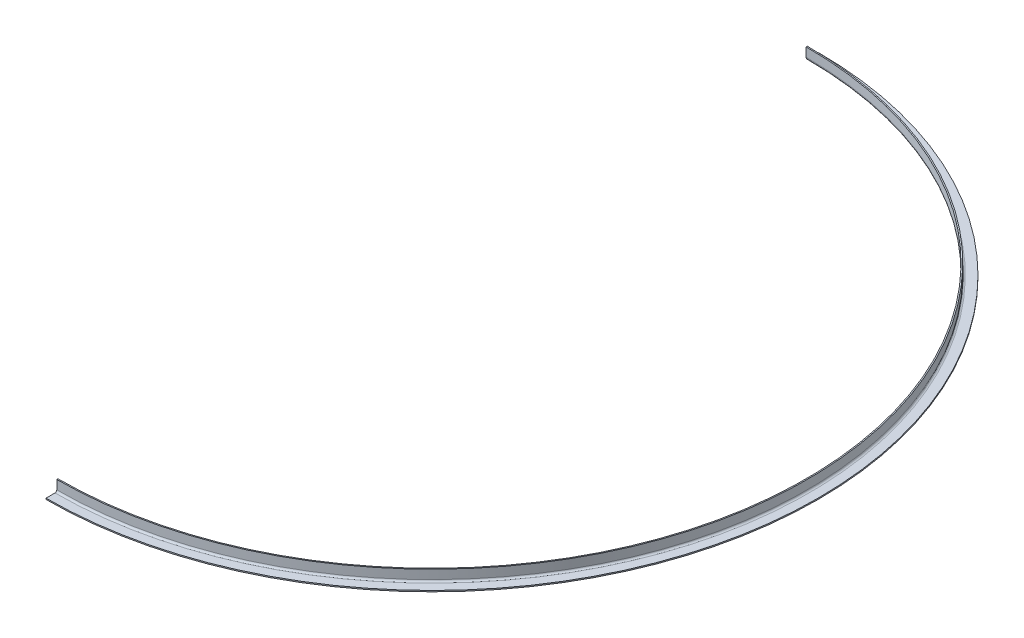
ISO-10303-21;
HEADER;
FILE_DESCRIPTION(('STEP AP214'),'2;1');
FILE_NAME('part.step','',(''),(''),'','','');
FILE_SCHEMA(('AUTOMOTIVE_DESIGN { 1 0 10303 214 1 1 1 1 }'));
ENDSEC;
DATA;
#1=APPLICATION_CONTEXT('core data for automotive mechanical design processes');
#2=APPLICATION_PROTOCOL_DEFINITION('international standard','automotive_design',2000,#1);
#3=PRODUCT_CONTEXT('',#1,'mechanical');
#4=PRODUCT('Part','Part','',(#3));
#5=PRODUCT_RELATED_PRODUCT_CATEGORY('part','',(#4));
#6=PRODUCT_DEFINITION_FORMATION('','',#4);
#7=PRODUCT_DEFINITION_CONTEXT('part definition',#1,'design');
#8=PRODUCT_DEFINITION('design','',#6,#7);
#9=PRODUCT_DEFINITION_SHAPE('','',#8);
#10=(LENGTH_UNIT() NAMED_UNIT(*) SI_UNIT(.MILLI.,.METRE.));
#11=(NAMED_UNIT(*) PLANE_ANGLE_UNIT() SI_UNIT($,.RADIAN.));
#12=(NAMED_UNIT(*) SI_UNIT($,.STERADIAN.) SOLID_ANGLE_UNIT());
#13=UNCERTAINTY_MEASURE_WITH_UNIT(LENGTH_MEASURE(1.E-05),#10,'distance_accuracy_value','');
#14=(GEOMETRIC_REPRESENTATION_CONTEXT(3) GLOBAL_UNCERTAINTY_ASSIGNED_CONTEXT((#13)) GLOBAL_UNIT_ASSIGNED_CONTEXT((#10,
#11,#12)) REPRESENTATION_CONTEXT('',''));
#15=CARTESIAN_POINT('',(0.,0.,0.));
#16=DIRECTION('',(0.,0.,1.));
#17=DIRECTION('',(1.,0.,0.));
#18=AXIS2_PLACEMENT_3D('',#15,#16,#17);
#19=CARTESIAN_POINT('',(0.,-4.,1250.));
#20=DIRECTION('',(-1.,0.,0.));
#21=DIRECTION('',(0.,0.,1.));
#22=AXIS2_PLACEMENT_3D('',#19,#20,#21);
#23=PLANE('',#22);
#24=DIRECTION('',(0.,0.,1.));
#25=VECTOR('',#24,1.);
#26=CARTESIAN_POINT('',(0.,-4.,1250.));
#27=LINE('',#26,#25);
#28=CARTESIAN_POINT('',(1.54305496692566E-13,-4.,1260.));
#29=VERTEX_POINT('',#28);
#30=CARTESIAN_POINT('',(0.,-4.,1290.));
#31=VERTEX_POINT('',#30);
#32=EDGE_CURVE('E141',#29,#31,#27,.T.);
#33=ORIENTED_EDGE('',*,*,#32,.T.);
#34=DIRECTION('',(0.,1.,0.));
#35=VECTOR('',#34,1.);
#36=CARTESIAN_POINT('',(0.,-4.,1290.));
#37=LINE('',#36,#35);
#38=CARTESIAN_POINT('',(0.,0.,1290.));
#39=VERTEX_POINT('',#38);
#40=EDGE_CURVE('E90',#31,#39,#37,.T.);
#41=ORIENTED_EDGE('',*,*,#40,.T.);
#42=DIRECTION('',(0.,0.,1.));
#43=VECTOR('',#42,1.);
#44=CARTESIAN_POINT('',(0.,0.,1250.));
#45=LINE('',#44,#43);
#46=CARTESIAN_POINT('',(0.,0.,1260.));
#47=VERTEX_POINT('',#46);
#48=EDGE_CURVE('E135',#47,#39,#45,.T.);
#49=ORIENTED_EDGE('',*,*,#48,.F.);
#50=DIRECTION('',(0.,1.,0.));
#51=VECTOR('',#50,1.);
#52=CARTESIAN_POINT('',(0.,0.,1260.));
#53=LINE('',#52,#51);
#54=EDGE_CURVE('E157',#29,#47,#53,.T.);
#55=ORIENTED_EDGE('',*,*,#54,.F.);
#56=EDGE_LOOP('',(#33,#41,#49,#55));
#57=FACE_BOUND('',#56,.T.);
#58=ADVANCED_FACE('F87',(#57),#23,.T.);
#59=CARTESIAN_POINT('',(0.,-4.,-1290.));
#60=DIRECTION('',(-1.,0.,0.));
#61=DIRECTION('',(0.,0.,1.));
#62=AXIS2_PLACEMENT_3D('',#59,#60,#61);
#63=PLANE('',#62);
#64=DIRECTION('',(0.,0.,1.));
#65=VECTOR('',#64,1.);
#66=CARTESIAN_POINT('',(0.,-4.,-1290.));
#67=LINE('',#66,#65);
#68=CARTESIAN_POINT('',(0.,-4.,-1290.));
#69=VERTEX_POINT('',#68);
#70=CARTESIAN_POINT('',(1.54305496692566E-13,-4.,-1260.));
#71=VERTEX_POINT('',#70);
#72=EDGE_CURVE('E147',#69,#71,#67,.T.);
#73=ORIENTED_EDGE('',*,*,#72,.T.);
#74=DIRECTION('',(0.,1.,0.));
#75=VECTOR('',#74,1.);
#76=CARTESIAN_POINT('',(1.54305496692566E-13,0.,-1260.));
#77=LINE('',#76,#75);
#78=CARTESIAN_POINT('',(1.54305496692566E-13,0.,-1260.));
#79=VERTEX_POINT('',#78);
#80=EDGE_CURVE('E140',#71,#79,#77,.T.);
#81=ORIENTED_EDGE('',*,*,#80,.T.);
#82=DIRECTION('',(0.,0.,1.));
#83=VECTOR('',#82,1.);
#84=CARTESIAN_POINT('',(0.,0.,-1290.));
#85=LINE('',#84,#83);
#86=CARTESIAN_POINT('',(0.,0.,-1290.));
#87=VERTEX_POINT('',#86);
#88=EDGE_CURVE('E132',#87,#79,#85,.T.);
#89=ORIENTED_EDGE('',*,*,#88,.F.);
#90=DIRECTION('',(0.,1.,0.));
#91=VECTOR('',#90,1.);
#92=CARTESIAN_POINT('',(0.,-4.,-1290.));
#93=LINE('',#92,#91);
#94=EDGE_CURVE('E12',#69,#87,#93,.T.);
#95=ORIENTED_EDGE('',*,*,#94,.F.);
#96=EDGE_LOOP('',(#73,#81,#89,#95));
#97=FACE_BOUND('',#96,.T.);
#98=ADVANCED_FACE('F138',(#97),#63,.T.);
#99=CARTESIAN_POINT('',(0.,-4.,0.));
#100=DIRECTION('',(0.,1.,0.));
#101=DIRECTION('',(0.,0.,1.));
#102=AXIS2_PLACEMENT_3D('',#99,#100,#101);
#103=CYLINDRICAL_SURFACE('',#102,1290.);
#104=CARTESIAN_POINT('',(0.,0.,0.));
#105=DIRECTION('',(0.,1.,0.));
#106=DIRECTION('',(0.,0.,1.));
#107=AXIS2_PLACEMENT_3D('',#104,#105,#106);
#108=CIRCLE('',#107,1290.);
#109=EDGE_CURVE('E123',#39,#87,#108,.T.);
#110=ORIENTED_EDGE('',*,*,#109,.F.);
#111=ORIENTED_EDGE('',*,*,#40,.F.);
#112=CARTESIAN_POINT('',(0.,-4.,0.));
#113=DIRECTION('',(0.,1.,0.));
#114=DIRECTION('',(0.,0.,1.));
#115=AXIS2_PLACEMENT_3D('',#112,#113,#114);
#116=CIRCLE('',#115,1290.);
#117=EDGE_CURVE('E125',#31,#69,#116,.T.);
#118=ORIENTED_EDGE('',*,*,#117,.T.);
#119=ORIENTED_EDGE('',*,*,#94,.T.);
#120=EDGE_LOOP('',(#110,#111,#118,#119));
#121=FACE_BOUND('',#120,.T.);
#122=ADVANCED_FACE('F121',(#121),#103,.T.);
#123=CARTESIAN_POINT('',(0.,-4.,0.));
#124=DIRECTION('',(0.,1.,0.));
#125=DIRECTION('',(0.,0.,1.));
#126=AXIS2_PLACEMENT_3D('',#123,#124,#125);
#127=PLANE('',#126);
#128=ORIENTED_EDGE('',*,*,#32,.F.);
#129=CARTESIAN_POINT('',(0.,-4.,0.));
#130=DIRECTION('',(0.,-1.,0.));
#131=DIRECTION('',(0.,0.,-1.));
#132=AXIS2_PLACEMENT_3D('',#129,#130,#131);
#133=CIRCLE('',#132,1260.);
#134=EDGE_CURVE('E173',#71,#29,#133,.T.);
#135=ORIENTED_EDGE('',*,*,#134,.F.);
#136=ORIENTED_EDGE('',*,*,#72,.F.);
#137=ORIENTED_EDGE('',*,*,#117,.F.);
#138=EDGE_LOOP('',(#128,#135,#136,#137));
#139=FACE_BOUND('',#138,.T.);
#140=ADVANCED_FACE('F233',(#139),#127,.F.);
#141=CARTESIAN_POINT('',(0.,0.,0.));
#142=DIRECTION('',(0.,1.,0.));
#143=DIRECTION('',(0.,0.,1.));
#144=AXIS2_PLACEMENT_3D('',#141,#142,#143);
#145=PLANE('',#144);
#146=CARTESIAN_POINT('',(0.,0.,0.));
#147=DIRECTION('',(0.,-1.,0.));
#148=DIRECTION('',(0.,0.,-1.));
#149=AXIS2_PLACEMENT_3D('',#146,#147,#148);
#150=CIRCLE('',#149,1260.);
#151=EDGE_CURVE('E196',#79,#47,#150,.T.);
#152=ORIENTED_EDGE('',*,*,#151,.T.);
#153=ORIENTED_EDGE('',*,*,#48,.T.);
#154=ORIENTED_EDGE('',*,*,#109,.T.);
#155=ORIENTED_EDGE('',*,*,#88,.T.);
#156=EDGE_LOOP('',(#152,#153,#154,#155));
#157=FACE_BOUND('',#156,.T.);
#158=ADVANCED_FACE('F130',(#157),#145,.T.);
#159=CARTESIAN_POINT('',(0.,6.,1260.));
#160=DIRECTION('',(1.,0.,0.));
#161=DIRECTION('',(0.,0.,-1.));
#162=AXIS2_PLACEMENT_3D('',#159,#160,#161);
#163=PLANE('',#162);
#164=DIRECTION('',(0.,0.,1.));
#165=VECTOR('',#164,1.);
#166=CARTESIAN_POINT('',(0.,6.00000000000004,1254.));
#167=LINE('',#166,#165);
#168=CARTESIAN_POINT('',(1.53080849893419E-13,6.00000000000004,1250.));
#169=VERTEX_POINT('',#168);
#170=CARTESIAN_POINT('',(0.,6.00000000000004,1254.));
#171=VERTEX_POINT('',#170);
#172=EDGE_CURVE('E146',#169,#171,#167,.T.);
#173=ORIENTED_EDGE('',*,*,#172,.F.);
#174=CARTESIAN_POINT('',(1.54305496692566E-13,6.,1260.));
#175=DIRECTION('',(1.,0.,0.));
#176=DIRECTION('',(0.,0.,-1.));
#177=AXIS2_PLACEMENT_3D('',#174,#175,#176);
#178=CIRCLE('',#177,10.);
#179=EDGE_CURVE('E170',#29,#169,#178,.T.);
#180=ORIENTED_EDGE('',*,*,#179,.F.);
#181=ORIENTED_EDGE('',*,*,#54,.T.);
#182=CARTESIAN_POINT('',(0.,6.,1260.));
#183=DIRECTION('',(-1.,0.,0.));
#184=DIRECTION('',(0.,0.,1.));
#185=AXIS2_PLACEMENT_3D('',#182,#183,#184);
#186=CIRCLE('',#185,6.);
#187=EDGE_CURVE('E101',#47,#171,#186,.F.);
#188=ORIENTED_EDGE('',*,*,#187,.T.);
#189=EDGE_LOOP('',(#173,#180,#181,#188));
#190=FACE_BOUND('',#189,.T.);
#191=ADVANCED_FACE('F225',(#190),#163,.F.);
#192=CARTESIAN_POINT('',(1.54305496692566E-13,6.,-1260.));
#193=DIRECTION('',(-1.,0.,0.));
#194=DIRECTION('',(0.,0.,1.));
#195=AXIS2_PLACEMENT_3D('',#192,#193,#194);
#196=PLANE('',#195);
#197=ORIENTED_EDGE('',*,*,#80,.F.);
#198=CARTESIAN_POINT('',(1.54305496692566E-13,6.,-1260.));
#199=DIRECTION('',(-1.,0.,0.));
#200=DIRECTION('',(0.,0.,1.));
#201=AXIS2_PLACEMENT_3D('',#198,#199,#200);
#202=CIRCLE('',#201,10.);
#203=CARTESIAN_POINT('',(1.53080849893419E-13,6.00000000000006,-1250.));
#204=VERTEX_POINT('',#203);
#205=EDGE_CURVE('E177',#71,#204,#202,.T.);
#206=ORIENTED_EDGE('',*,*,#205,.T.);
#207=DIRECTION('',(0.,0.,-1.));
#208=VECTOR('',#207,1.);
#209=CARTESIAN_POINT('',(1.53570708613078E-13,6.00000000000004,-1254.));
#210=LINE('',#209,#208);
#211=CARTESIAN_POINT('',(1.53570708613078E-13,6.00000000000004,-1254.));
#212=VERTEX_POINT('',#211);
#213=EDGE_CURVE('E160',#204,#212,#210,.T.);
#214=ORIENTED_EDGE('',*,*,#213,.T.);
#215=CARTESIAN_POINT('',(1.54305496692566E-13,6.,-1260.));
#216=DIRECTION('',(1.,0.,0.));
#217=DIRECTION('',(0.,0.,-1.));
#218=AXIS2_PLACEMENT_3D('',#215,#216,#217);
#219=CIRCLE('',#218,6.);
#220=EDGE_CURVE('E184',#79,#212,#219,.F.);
#221=ORIENTED_EDGE('',*,*,#220,.F.);
#222=EDGE_LOOP('',(#197,#206,#214,#221));
#223=FACE_BOUND('',#222,.T.);
#224=ADVANCED_FACE('F290',(#223),#196,.T.);
#225=CARTESIAN_POINT('',(1.53570708613078E-13,21.,-1254.));
#226=DIRECTION('',(-1.,0.,0.));
#227=DIRECTION('',(0.,1.,0.));
#228=AXIS2_PLACEMENT_3D('',#225,#226,#227);
#229=PLANE('',#228);
#230=ORIENTED_EDGE('',*,*,#213,.F.);
#231=DIRECTION('',(0.,-1.,0.));
#232=VECTOR('',#231,1.);
#233=CARTESIAN_POINT('',(1.53080849893419E-13,0.,-1250.));
#234=LINE('',#233,#232);
#235=CARTESIAN_POINT('',(1.53080849893419E-13,36.,-1250.));
#236=VERTEX_POINT('',#235);
#237=EDGE_CURVE('E176',#204,#236,#234,.F.);
#238=ORIENTED_EDGE('',*,*,#237,.T.);
#239=DIRECTION('',(0.,0.,-1.));
#240=VECTOR('',#239,1.);
#241=CARTESIAN_POINT('',(1.53570708613078E-13,36.,-1254.));
#242=LINE('',#241,#240);
#243=CARTESIAN_POINT('',(1.53570708613078E-13,36.,-1254.));
#244=VERTEX_POINT('',#243);
#245=EDGE_CURVE('E153',#236,#244,#242,.T.);
#246=ORIENTED_EDGE('',*,*,#245,.T.);
#247=DIRECTION('',(0.,1.,0.));
#248=VECTOR('',#247,1.);
#249=CARTESIAN_POINT('',(1.53570708613078E-13,0.,-1254.));
#250=LINE('',#249,#248);
#251=EDGE_CURVE('E193',#212,#244,#250,.T.);
#252=ORIENTED_EDGE('',*,*,#251,.F.);
#253=EDGE_LOOP('',(#230,#238,#246,#252));
#254=FACE_BOUND('',#253,.T.);
#255=ADVANCED_FACE('F212',(#254),#229,.T.);
#256=CARTESIAN_POINT('',(0.,36.,0.));
#257=DIRECTION('',(0.,1.,0.));
#258=DIRECTION('',(0.,0.,1.));
#259=AXIS2_PLACEMENT_3D('',#256,#257,#258);
#260=PLANE('',#259);
#261=ORIENTED_EDGE('',*,*,#245,.F.);
#262=CARTESIAN_POINT('',(0.,36.,0.));
#263=DIRECTION('',(0.,-1.,0.));
#264=DIRECTION('',(0.,0.,-1.));
#265=AXIS2_PLACEMENT_3D('',#262,#263,#264);
#266=CIRCLE('',#265,1250.);
#267=CARTESIAN_POINT('',(1.53080849893419E-13,36.,1250.));
#268=VERTEX_POINT('',#267);
#269=EDGE_CURVE('E168',#236,#268,#266,.T.);
#270=ORIENTED_EDGE('',*,*,#269,.T.);
#271=DIRECTION('',(0.,0.,1.));
#272=VECTOR('',#271,1.);
#273=CARTESIAN_POINT('',(0.,36.,1254.));
#274=LINE('',#273,#272);
#275=CARTESIAN_POINT('',(0.,36.,1254.));
#276=VERTEX_POINT('',#275);
#277=EDGE_CURVE('E150',#268,#276,#274,.T.);
#278=ORIENTED_EDGE('',*,*,#277,.T.);
#279=CARTESIAN_POINT('',(0.,36.,0.));
#280=DIRECTION('',(0.,-1.,0.));
#281=DIRECTION('',(0.,0.,-1.));
#282=AXIS2_PLACEMENT_3D('',#279,#280,#281);
#283=CIRCLE('',#282,1254.);
#284=EDGE_CURVE('E154',#244,#276,#283,.T.);
#285=ORIENTED_EDGE('',*,*,#284,.F.);
#286=EDGE_LOOP('',(#261,#270,#278,#285));
#287=FACE_BOUND('',#286,.T.);
#288=ADVANCED_FACE('F249',(#287),#260,.T.);
#289=CARTESIAN_POINT('',(0.,21.,1254.));
#290=DIRECTION('',(1.,0.,0.));
#291=DIRECTION('',(0.,1.,0.));
#292=AXIS2_PLACEMENT_3D('',#289,#290,#291);
#293=PLANE('',#292);
#294=DIRECTION('',(0.,-1.,0.));
#295=VECTOR('',#294,1.);
#296=CARTESIAN_POINT('',(1.53080849893419E-13,0.,1250.));
#297=LINE('',#296,#295);
#298=EDGE_CURVE('E165',#169,#268,#297,.F.);
#299=ORIENTED_EDGE('',*,*,#298,.F.);
#300=ORIENTED_EDGE('',*,*,#172,.T.);
#301=DIRECTION('',(0.,1.,0.));
#302=VECTOR('',#301,1.);
#303=CARTESIAN_POINT('',(0.,0.,1254.));
#304=LINE('',#303,#302);
#305=EDGE_CURVE('E189',#171,#276,#304,.T.);
#306=ORIENTED_EDGE('',*,*,#305,.T.);
#307=ORIENTED_EDGE('',*,*,#277,.F.);
#308=EDGE_LOOP('',(#299,#300,#306,#307));
#309=FACE_BOUND('',#308,.T.);
#310=ADVANCED_FACE('F254',(#309),#293,.F.);
#311=CARTESIAN_POINT('',(0.,0.,0.));
#312=DIRECTION('',(0.,-1.,0.));
#313=DIRECTION('',(0.,0.,-1.));
#314=AXIS2_PLACEMENT_3D('',#311,#312,#313);
#315=CYLINDRICAL_SURFACE('',#314,1254.);
#316=ORIENTED_EDGE('',*,*,#284,.T.);
#317=ORIENTED_EDGE('',*,*,#305,.F.);
#318=CARTESIAN_POINT('',(0.,6.00000000000004,0.));
#319=DIRECTION('',(0.,-1.,0.));
#320=DIRECTION('',(0.,0.,-1.));
#321=AXIS2_PLACEMENT_3D('',#318,#319,#320);
#322=CIRCLE('',#321,1254.);
#323=EDGE_CURVE('E192',#212,#171,#322,.T.);
#324=ORIENTED_EDGE('',*,*,#323,.F.);
#325=ORIENTED_EDGE('',*,*,#251,.T.);
#326=EDGE_LOOP('',(#316,#317,#324,#325));
#327=FACE_BOUND('',#326,.T.);
#328=ADVANCED_FACE('F219',(#327),#315,.T.);
#329=CARTESIAN_POINT('',(0.,6.,0.));
#330=DIRECTION('',(0.,-1.,0.));
#331=DIRECTION('',(0.,0.,-1.));
#332=AXIS2_PLACEMENT_3D('',#329,#330,#331);
#333=TOROIDAL_SURFACE('',#332,1260.,6.);
#334=ORIENTED_EDGE('',*,*,#323,.T.);
#335=ORIENTED_EDGE('',*,*,#187,.F.);
#336=ORIENTED_EDGE('',*,*,#151,.F.);
#337=ORIENTED_EDGE('',*,*,#220,.T.);
#338=EDGE_LOOP('',(#334,#335,#336,#337));
#339=FACE_BOUND('',#338,.T.);
#340=ADVANCED_FACE('F204',(#339),#333,.F.);
#341=CARTESIAN_POINT('',(0.,0.,0.));
#342=DIRECTION('',(0.,-1.,0.));
#343=DIRECTION('',(0.,0.,-1.));
#344=AXIS2_PLACEMENT_3D('',#341,#342,#343);
#345=CYLINDRICAL_SURFACE('',#344,1250.);
#346=ORIENTED_EDGE('',*,*,#269,.F.);
#347=ORIENTED_EDGE('',*,*,#237,.F.);
#348=CARTESIAN_POINT('',(0.,6.00000000000006,0.));
#349=DIRECTION('',(0.,-1.,0.));
#350=DIRECTION('',(0.,0.,-1.));
#351=AXIS2_PLACEMENT_3D('',#348,#349,#350);
#352=CIRCLE('',#351,1250.);
#353=EDGE_CURVE('E169',#204,#169,#352,.T.);
#354=ORIENTED_EDGE('',*,*,#353,.T.);
#355=ORIENTED_EDGE('',*,*,#298,.T.);
#356=EDGE_LOOP('',(#346,#347,#354,#355));
#357=FACE_BOUND('',#356,.T.);
#358=ADVANCED_FACE('F253',(#357),#345,.F.);
#359=CARTESIAN_POINT('',(0.,6.,0.));
#360=DIRECTION('',(0.,-1.,0.));
#361=DIRECTION('',(0.,0.,-1.));
#362=AXIS2_PLACEMENT_3D('',#359,#360,#361);
#363=TOROIDAL_SURFACE('',#362,1260.,10.);
#364=ORIENTED_EDGE('',*,*,#353,.F.);
#365=ORIENTED_EDGE('',*,*,#205,.F.);
#366=ORIENTED_EDGE('',*,*,#134,.T.);
#367=ORIENTED_EDGE('',*,*,#179,.T.);
#368=EDGE_LOOP('',(#364,#365,#366,#367));
#369=FACE_BOUND('',#368,.T.);
#370=ADVANCED_FACE('F337',(#369),#363,.T.);
#371=CLOSED_SHELL('',(#58,#98,#122,#140,#158,#191,#224,#255,#288,#310,#328,#340,#358,#370));
#372=MANIFOLD_SOLID_BREP('B2',#371);
#373=ADVANCED_BREP_SHAPE_REPRESENTATION('',(#18,#372),#14);
#374=SHAPE_DEFINITION_REPRESENTATION(#9,#373);
ENDSEC;
END-ISO-10303-21;
